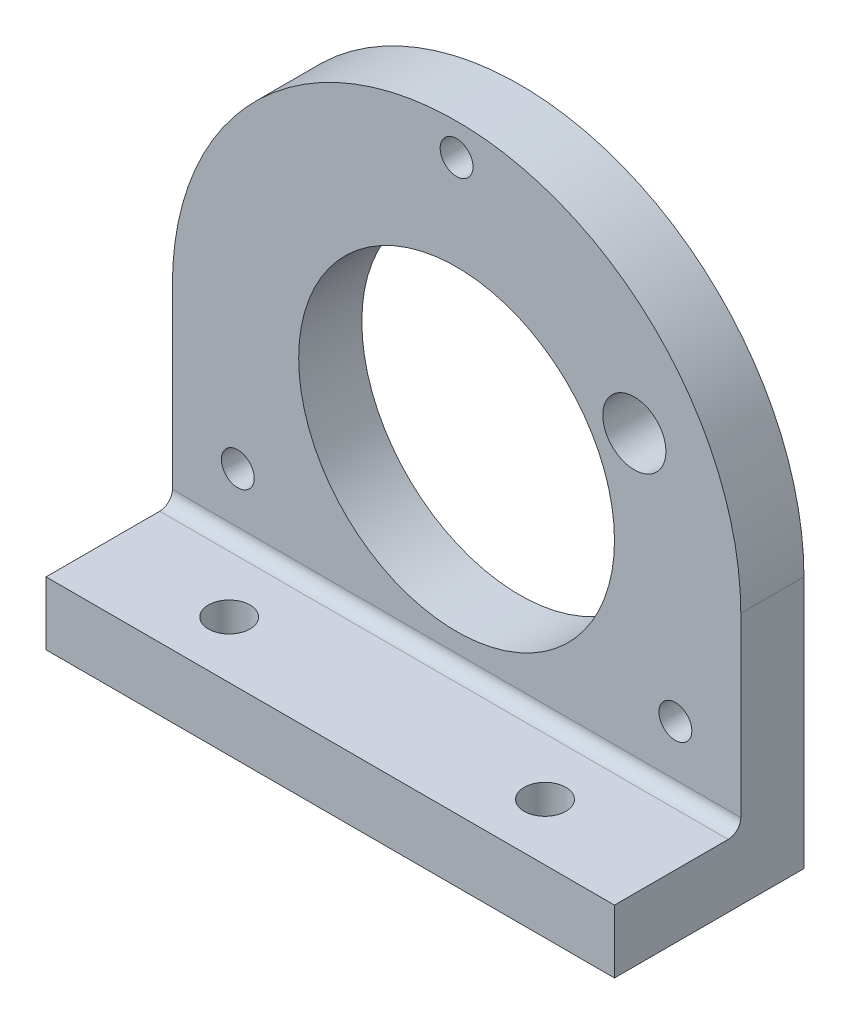
ISO-10303-21;
HEADER;
FILE_DESCRIPTION(('STEP AP214'),'2;1');
FILE_NAME('part.step','',(''),(''),'','','');
FILE_SCHEMA(('AUTOMOTIVE_DESIGN { 1 0 10303 214 1 1 1 1 }'));
ENDSEC;
DATA;
#1=APPLICATION_CONTEXT('core data for automotive mechanical design processes');
#2=APPLICATION_PROTOCOL_DEFINITION('international standard','automotive_design',2000,#1);
#3=PRODUCT_CONTEXT('',#1,'mechanical');
#4=PRODUCT('Part','Part','',(#3));
#5=PRODUCT_RELATED_PRODUCT_CATEGORY('part','',(#4));
#6=PRODUCT_DEFINITION_FORMATION('','',#4);
#7=PRODUCT_DEFINITION_CONTEXT('part definition',#1,'design');
#8=PRODUCT_DEFINITION('design','',#6,#7);
#9=PRODUCT_DEFINITION_SHAPE('','',#8);
#10=(LENGTH_UNIT() NAMED_UNIT(*) SI_UNIT(.MILLI.,.METRE.));
#11=(NAMED_UNIT(*) PLANE_ANGLE_UNIT() SI_UNIT($,.RADIAN.));
#12=(NAMED_UNIT(*) SI_UNIT($,.STERADIAN.) SOLID_ANGLE_UNIT());
#13=UNCERTAINTY_MEASURE_WITH_UNIT(LENGTH_MEASURE(1.E-05),#10,'distance_accuracy_value','');
#14=(GEOMETRIC_REPRESENTATION_CONTEXT(3) GLOBAL_UNCERTAINTY_ASSIGNED_CONTEXT((#13)) GLOBAL_UNIT_ASSIGNED_CONTEXT((#10,
#11,#12)) REPRESENTATION_CONTEXT('',''));
#15=CARTESIAN_POINT('',(0.,0.,0.));
#16=DIRECTION('',(0.,0.,1.));
#17=DIRECTION('',(1.,0.,0.));
#18=AXIS2_PLACEMENT_3D('',#15,#16,#17);
#19=CARTESIAN_POINT('',(0.,0.,4.));
#20=DIRECTION('',(0.,0.,-1.));
#21=DIRECTION('',(-1.,0.,0.));
#22=AXIS2_PLACEMENT_3D('',#19,#20,#21);
#23=CYLINDRICAL_SURFACE('',#22,22.5);
#24=CARTESIAN_POINT('',(0.,0.,7.));
#25=DIRECTION('',(0.,0.,-1.));
#26=DIRECTION('',(-1.,0.,0.));
#27=AXIS2_PLACEMENT_3D('',#24,#25,#26);
#28=CIRCLE('',#27,22.5);
#29=CARTESIAN_POINT('',(-22.5,0.,7.));
#30=VERTEX_POINT('',#29);
#31=CARTESIAN_POINT('',(22.5,0.,7.));
#32=VERTEX_POINT('',#31);
#33=EDGE_CURVE('E50',#30,#32,#28,.T.);
#34=ORIENTED_EDGE('',*,*,#33,.F.);
#35=DIRECTION('',(0.,0.,1.));
#36=VECTOR('',#35,1.);
#37=CARTESIAN_POINT('',(-22.5,0.,-23.4232921921325));
#38=LINE('',#37,#36);
#39=CARTESIAN_POINT('',(-22.5,0.,12.));
#40=VERTEX_POINT('',#39);
#41=EDGE_CURVE('E116',#30,#40,#38,.T.);
#42=ORIENTED_EDGE('',*,*,#41,.T.);
#43=CARTESIAN_POINT('',(0.,0.,12.));
#44=DIRECTION('',(0.,0.,-1.));
#45=DIRECTION('',(-1.,0.,0.));
#46=AXIS2_PLACEMENT_3D('',#43,#44,#45);
#47=CIRCLE('',#46,22.5);
#48=CARTESIAN_POINT('',(22.5,0.,12.));
#49=VERTEX_POINT('',#48);
#50=EDGE_CURVE('E159',#40,#49,#47,.T.);
#51=ORIENTED_EDGE('',*,*,#50,.T.);
#52=DIRECTION('',(0.,0.,1.));
#53=VECTOR('',#52,1.);
#54=CARTESIAN_POINT('',(22.5,0.,-23.4232921921325));
#55=LINE('',#54,#53);
#56=EDGE_CURVE('E113',#32,#49,#55,.T.);
#57=ORIENTED_EDGE('',*,*,#56,.F.);
#58=EDGE_LOOP('',(#34,#42,#51,#57));
#59=FACE_BOUND('',#58,.T.);
#60=ADVANCED_FACE('F34',(#59),#23,.T.);
#61=CARTESIAN_POINT('',(0.,0.,4.));
#62=DIRECTION('',(0.,0.,-1.));
#63=DIRECTION('',(-1.,0.,0.));
#64=AXIS2_PLACEMENT_3D('',#61,#62,#63);
#65=CYLINDRICAL_SURFACE('',#64,12.5);
#66=CARTESIAN_POINT('',(0.,0.,12.));
#67=DIRECTION('',(0.,0.,-1.));
#68=DIRECTION('',(-1.,0.,0.));
#69=AXIS2_PLACEMENT_3D('',#66,#67,#68);
#70=CIRCLE('',#69,12.5);
#71=CARTESIAN_POINT('',(-12.5,0.,12.));
#72=VERTEX_POINT('',#71);
#73=EDGE_CURVE('E161',#72,#72,#70,.T.);
#74=ORIENTED_EDGE('',*,*,#73,.F.);
#75=EDGE_LOOP('',(#74));
#76=FACE_BOUND('',#75,.T.);
#77=CARTESIAN_POINT('',(0.,0.,7.));
#78=DIRECTION('',(0.,0.,-1.));
#79=DIRECTION('',(-1.,0.,0.));
#80=AXIS2_PLACEMENT_3D('',#77,#78,#79);
#81=CIRCLE('',#80,12.5);
#82=CARTESIAN_POINT('',(-12.5,0.,7.));
#83=VERTEX_POINT('',#82);
#84=EDGE_CURVE('E184',#83,#83,#81,.T.);
#85=ORIENTED_EDGE('',*,*,#84,.T.);
#86=EDGE_LOOP('',(#85));
#87=FACE_BOUND('',#86,.T.);
#88=ADVANCED_FACE('F177',(#76,#87),#65,.F.);
#89=CARTESIAN_POINT('',(0.,20.,4.));
#90=DIRECTION('',(0.,0.,-1.));
#91=DIRECTION('',(-1.,0.,0.));
#92=AXIS2_PLACEMENT_3D('',#89,#90,#91);
#93=CYLINDRICAL_SURFACE('',#92,1.3);
#94=CARTESIAN_POINT('',(0.,20.,12.));
#95=DIRECTION('',(0.,0.,-1.));
#96=DIRECTION('',(-1.,0.,0.));
#97=AXIS2_PLACEMENT_3D('',#94,#95,#96);
#98=CIRCLE('',#97,1.3);
#99=CARTESIAN_POINT('',(-1.3,20.,12.));
#100=VERTEX_POINT('',#99);
#101=EDGE_CURVE('E168',#100,#100,#98,.T.);
#102=ORIENTED_EDGE('',*,*,#101,.F.);
#103=EDGE_LOOP('',(#102));
#104=FACE_BOUND('',#103,.T.);
#105=CARTESIAN_POINT('',(0.,20.,7.));
#106=DIRECTION('',(0.,0.,-1.));
#107=DIRECTION('',(-1.,0.,0.));
#108=AXIS2_PLACEMENT_3D('',#105,#106,#107);
#109=CIRCLE('',#108,1.3);
#110=CARTESIAN_POINT('',(-1.3,20.,7.));
#111=VERTEX_POINT('',#110);
#112=EDGE_CURVE('E186',#111,#111,#109,.T.);
#113=ORIENTED_EDGE('',*,*,#112,.T.);
#114=EDGE_LOOP('',(#113));
#115=FACE_BOUND('',#114,.T.);
#116=ADVANCED_FACE('F180',(#104,#115),#93,.F.);
#117=CARTESIAN_POINT('',(-17.3205080756888,-10.,4.));
#118=DIRECTION('',(0.,0.,-1.));
#119=DIRECTION('',(-1.,0.,0.));
#120=AXIS2_PLACEMENT_3D('',#117,#118,#119);
#121=CYLINDRICAL_SURFACE('',#120,1.3);
#122=CARTESIAN_POINT('',(-17.3205080756888,-10.,12.));
#123=DIRECTION('',(0.,0.,-1.));
#124=DIRECTION('',(-1.,0.,0.));
#125=AXIS2_PLACEMENT_3D('',#122,#123,#124);
#126=CIRCLE('',#125,1.3);
#127=CARTESIAN_POINT('',(-18.6205080756888,-10.,12.));
#128=VERTEX_POINT('',#127);
#129=EDGE_CURVE('E165',#128,#128,#126,.T.);
#130=ORIENTED_EDGE('',*,*,#129,.F.);
#131=EDGE_LOOP('',(#130));
#132=FACE_BOUND('',#131,.T.);
#133=CARTESIAN_POINT('',(-17.3205080756888,-10.,7.));
#134=DIRECTION('',(0.,0.,-1.));
#135=DIRECTION('',(-1.,0.,0.));
#136=AXIS2_PLACEMENT_3D('',#133,#134,#135);
#137=CIRCLE('',#136,1.3);
#138=CARTESIAN_POINT('',(-18.6205080756888,-10.,7.));
#139=VERTEX_POINT('',#138);
#140=EDGE_CURVE('E191',#139,#139,#137,.T.);
#141=ORIENTED_EDGE('',*,*,#140,.T.);
#142=EDGE_LOOP('',(#141));
#143=FACE_BOUND('',#142,.T.);
#144=ADVANCED_FACE('F213',(#132,#143),#121,.F.);
#145=CARTESIAN_POINT('',(17.3205080756888,-10.,4.));
#146=DIRECTION('',(0.,0.,-1.));
#147=DIRECTION('',(-1.,0.,0.));
#148=AXIS2_PLACEMENT_3D('',#145,#146,#147);
#149=CYLINDRICAL_SURFACE('',#148,1.3);
#150=CARTESIAN_POINT('',(17.3205080756888,-10.,12.));
#151=DIRECTION('',(0.,0.,-1.));
#152=DIRECTION('',(-1.,0.,0.));
#153=AXIS2_PLACEMENT_3D('',#150,#151,#152);
#154=CIRCLE('',#153,1.3);
#155=CARTESIAN_POINT('',(16.0205080756888,-10.,12.));
#156=VERTEX_POINT('',#155);
#157=EDGE_CURVE('E162',#156,#156,#154,.T.);
#158=ORIENTED_EDGE('',*,*,#157,.F.);
#159=EDGE_LOOP('',(#158));
#160=FACE_BOUND('',#159,.T.);
#161=CARTESIAN_POINT('',(17.3205080756888,-10.,7.));
#162=DIRECTION('',(0.,0.,-1.));
#163=DIRECTION('',(-1.,0.,0.));
#164=AXIS2_PLACEMENT_3D('',#161,#162,#163);
#165=CIRCLE('',#164,1.3);
#166=CARTESIAN_POINT('',(16.0205080756888,-10.,7.));
#167=VERTEX_POINT('',#166);
#168=EDGE_CURVE('E241',#167,#167,#165,.T.);
#169=ORIENTED_EDGE('',*,*,#168,.T.);
#170=EDGE_LOOP('',(#169));
#171=FACE_BOUND('',#170,.T.);
#172=ADVANCED_FACE('F217',(#160,#171),#149,.F.);
#173=CARTESIAN_POINT('',(-22.5,-20.,-23.4232921921325));
#174=DIRECTION('',(0.,-1.,0.));
#175=DIRECTION('',(1.,0.,0.));
#176=AXIS2_PLACEMENT_3D('',#173,#174,#175);
#177=PLANE('',#176);
#178=CARTESIAN_POINT('',(-12.5,-20.,17.5));
#179=DIRECTION('',(0.,-1.,0.));
#180=DIRECTION('',(1.,0.,0.));
#181=AXIS2_PLACEMENT_3D('',#178,#179,#180);
#182=CIRCLE('',#181,1.65);
#183=CARTESIAN_POINT('',(-10.85,-20.,17.5));
#184=VERTEX_POINT('',#183);
#185=EDGE_CURVE('E269',#184,#184,#182,.T.);
#186=ORIENTED_EDGE('',*,*,#185,.F.);
#187=EDGE_LOOP('',(#186));
#188=FACE_BOUND('',#187,.T.);
#189=CARTESIAN_POINT('',(12.5,-20.,17.5));
#190=DIRECTION('',(0.,-1.,0.));
#191=DIRECTION('',(1.,0.,0.));
#192=AXIS2_PLACEMENT_3D('',#189,#190,#191);
#193=CIRCLE('',#192,1.65);
#194=CARTESIAN_POINT('',(14.15,-20.,17.5));
#195=VERTEX_POINT('',#194);
#196=EDGE_CURVE('E273',#195,#195,#193,.T.);
#197=ORIENTED_EDGE('',*,*,#196,.F.);
#198=EDGE_LOOP('',(#197));
#199=FACE_BOUND('',#198,.T.);
#200=DIRECTION('',(0.,0.,1.));
#201=VECTOR('',#200,1.);
#202=CARTESIAN_POINT('',(-22.5,-20.,-23.4232921921325));
#203=LINE('',#202,#201);
#204=CARTESIAN_POINT('',(-22.5,-20.,7.));
#205=VERTEX_POINT('',#204);
#206=CARTESIAN_POINT('',(-22.5,-20.,22.));
#207=VERTEX_POINT('',#206);
#208=EDGE_CURVE('E106',#205,#207,#203,.T.);
#209=ORIENTED_EDGE('',*,*,#208,.F.);
#210=DIRECTION('',(-1.,0.,0.));
#211=VECTOR('',#210,1.);
#212=CARTESIAN_POINT('',(22.5,-20.,7.));
#213=LINE('',#212,#211);
#214=CARTESIAN_POINT('',(22.5,-20.,7.));
#215=VERTEX_POINT('',#214);
#216=EDGE_CURVE('E94',#215,#205,#213,.T.);
#217=ORIENTED_EDGE('',*,*,#216,.F.);
#218=DIRECTION('',(0.,0.,1.));
#219=VECTOR('',#218,1.);
#220=CARTESIAN_POINT('',(22.5,-20.,-23.4232921921325));
#221=LINE('',#220,#219);
#222=CARTESIAN_POINT('',(22.5,-20.,22.));
#223=VERTEX_POINT('',#222);
#224=EDGE_CURVE('E104',#215,#223,#221,.T.);
#225=ORIENTED_EDGE('',*,*,#224,.T.);
#226=DIRECTION('',(1.,0.,0.));
#227=VECTOR('',#226,1.);
#228=CARTESIAN_POINT('',(-22.5,-20.,22.));
#229=LINE('',#228,#227);
#230=EDGE_CURVE('E188',#207,#223,#229,.T.);
#231=ORIENTED_EDGE('',*,*,#230,.F.);
#232=EDGE_LOOP('',(#209,#217,#225,#231));
#233=FACE_BOUND('',#232,.T.);
#234=ADVANCED_FACE('F102',(#188,#199,#233),#177,.T.);
#235=CARTESIAN_POINT('',(-22.5,0.,-23.4232921921325));
#236=DIRECTION('',(-1.,0.,0.));
#237=DIRECTION('',(0.,0.,1.));
#238=AXIS2_PLACEMENT_3D('',#235,#236,#237);
#239=PLANE('',#238);
#240=ORIENTED_EDGE('',*,*,#41,.F.);
#241=DIRECTION('',(0.,1.,0.));
#242=VECTOR('',#241,1.);
#243=CARTESIAN_POINT('',(-22.5,-20.,7.));
#244=LINE('',#243,#242);
#245=EDGE_CURVE('E107',#205,#30,#244,.T.);
#246=ORIENTED_EDGE('',*,*,#245,.F.);
#247=ORIENTED_EDGE('',*,*,#208,.T.);
#248=DIRECTION('',(0.,-1.,0.));
#249=VECTOR('',#248,1.);
#250=CARTESIAN_POINT('',(-22.5,-20.,22.));
#251=LINE('',#250,#249);
#252=CARTESIAN_POINT('',(-22.5,-15.,22.));
#253=VERTEX_POINT('',#252);
#254=EDGE_CURVE('E149',#253,#207,#251,.T.);
#255=ORIENTED_EDGE('',*,*,#254,.F.);
#256=DIRECTION('',(0.,0.,-1.));
#257=VECTOR('',#256,1.);
#258=CARTESIAN_POINT('',(-22.5,-15.,22.));
#259=LINE('',#258,#257);
#260=CARTESIAN_POINT('',(-22.5,-15.,13.));
#261=VERTEX_POINT('',#260);
#262=EDGE_CURVE('E143',#253,#261,#259,.T.);
#263=ORIENTED_EDGE('',*,*,#262,.T.);
#264=CARTESIAN_POINT('',(-22.5,-14.,13.));
#265=DIRECTION('',(-1.,0.,0.));
#266=DIRECTION('',(0.,0.,1.));
#267=AXIS2_PLACEMENT_3D('',#264,#265,#266);
#268=CIRCLE('',#267,1.);
#269=CARTESIAN_POINT('',(-22.5,-14.,12.));
#270=VERTEX_POINT('',#269);
#271=EDGE_CURVE('E43',#261,#270,#268,.F.);
#272=ORIENTED_EDGE('',*,*,#271,.T.);
#273=DIRECTION('',(0.,-1.,0.));
#274=VECTOR('',#273,1.);
#275=CARTESIAN_POINT('',(-22.5,-20.,12.));
#276=LINE('',#275,#274);
#277=EDGE_CURVE('E119',#40,#270,#276,.T.);
#278=ORIENTED_EDGE('',*,*,#277,.F.);
#279=EDGE_LOOP('',(#240,#246,#247,#255,#263,#272,#278));
#280=FACE_BOUND('',#279,.T.);
#281=ADVANCED_FACE('F147',(#280),#239,.T.);
#282=CARTESIAN_POINT('',(22.5,-20.,-23.4232921921325));
#283=DIRECTION('',(1.,0.,0.));
#284=DIRECTION('',(0.,0.,-1.));
#285=AXIS2_PLACEMENT_3D('',#282,#283,#284);
#286=PLANE('',#285);
#287=ORIENTED_EDGE('',*,*,#224,.F.);
#288=DIRECTION('',(0.,-1.,0.));
#289=VECTOR('',#288,1.);
#290=CARTESIAN_POINT('',(22.5,0.,7.));
#291=LINE('',#290,#289);
#292=EDGE_CURVE('E90',#32,#215,#291,.T.);
#293=ORIENTED_EDGE('',*,*,#292,.F.);
#294=ORIENTED_EDGE('',*,*,#56,.T.);
#295=DIRECTION('',(0.,1.,0.));
#296=VECTOR('',#295,1.);
#297=CARTESIAN_POINT('',(22.5,-20.,12.));
#298=LINE('',#297,#296);
#299=CARTESIAN_POINT('',(22.5,-14.,12.));
#300=VERTEX_POINT('',#299);
#301=EDGE_CURVE('E114',#300,#49,#298,.T.);
#302=ORIENTED_EDGE('',*,*,#301,.F.);
#303=CARTESIAN_POINT('',(22.5,-14.,13.));
#304=DIRECTION('',(1.,0.,0.));
#305=DIRECTION('',(0.,0.,-1.));
#306=AXIS2_PLACEMENT_3D('',#303,#304,#305);
#307=CIRCLE('',#306,1.);
#308=CARTESIAN_POINT('',(22.5,-15.,13.));
#309=VERTEX_POINT('',#308);
#310=EDGE_CURVE('E11',#300,#309,#307,.F.);
#311=ORIENTED_EDGE('',*,*,#310,.T.);
#312=DIRECTION('',(0.,0.,-1.));
#313=VECTOR('',#312,1.);
#314=CARTESIAN_POINT('',(22.5,-15.,22.));
#315=LINE('',#314,#313);
#316=CARTESIAN_POINT('',(22.5,-15.,22.));
#317=VERTEX_POINT('',#316);
#318=EDGE_CURVE('E145',#317,#309,#315,.T.);
#319=ORIENTED_EDGE('',*,*,#318,.F.);
#320=DIRECTION('',(0.,1.,0.));
#321=VECTOR('',#320,1.);
#322=CARTESIAN_POINT('',(22.5,-20.,22.));
#323=LINE('',#322,#321);
#324=EDGE_CURVE('E112',#223,#317,#323,.T.);
#325=ORIENTED_EDGE('',*,*,#324,.F.);
#326=EDGE_LOOP('',(#287,#293,#294,#302,#311,#319,#325));
#327=FACE_BOUND('',#326,.T.);
#328=ADVANCED_FACE('F110',(#327),#286,.T.);
#329=CARTESIAN_POINT('',(14.0715154312395,8.12419322213215,2.));
#330=DIRECTION('',(0.,0.,1.));
#331=DIRECTION('',(1.,0.,0.));
#332=AXIS2_PLACEMENT_3D('',#329,#330,#331);
#333=CYLINDRICAL_SURFACE('',#332,2.5);
#334=CARTESIAN_POINT('',(14.0715154312395,8.12419322213215,12.));
#335=DIRECTION('',(0.,0.,1.));
#336=DIRECTION('',(1.,0.,0.));
#337=AXIS2_PLACEMENT_3D('',#334,#335,#336);
#338=CIRCLE('',#337,2.5);
#339=CARTESIAN_POINT('',(16.5715154312395,8.12419322213215,12.));
#340=VERTEX_POINT('',#339);
#341=EDGE_CURVE('E152',#340,#340,#338,.T.);
#342=ORIENTED_EDGE('',*,*,#341,.T.);
#343=EDGE_LOOP('',(#342));
#344=FACE_BOUND('',#343,.T.);
#345=CARTESIAN_POINT('',(14.0715154312395,8.12419322213215,7.));
#346=DIRECTION('',(0.,0.,-1.));
#347=DIRECTION('',(-1.,0.,0.));
#348=AXIS2_PLACEMENT_3D('',#345,#346,#347);
#349=CIRCLE('',#348,2.5);
#350=CARTESIAN_POINT('',(11.5715154312395,8.12419322213215,7.));
#351=VERTEX_POINT('',#350);
#352=EDGE_CURVE('E38',#351,#351,#349,.F.);
#353=ORIENTED_EDGE('',*,*,#352,.F.);
#354=EDGE_LOOP('',(#353));
#355=FACE_BOUND('',#354,.T.);
#356=ADVANCED_FACE('F229',(#344,#355),#333,.F.);
#357=CARTESIAN_POINT('',(0.,0.,12.));
#358=DIRECTION('',(0.,0.,-1.));
#359=DIRECTION('',(-1.,0.,0.));
#360=AXIS2_PLACEMENT_3D('',#357,#358,#359);
#361=PLANE('',#360);
#362=ORIENTED_EDGE('',*,*,#157,.T.);
#363=EDGE_LOOP('',(#362));
#364=FACE_BOUND('',#363,.T.);
#365=ORIENTED_EDGE('',*,*,#129,.T.);
#366=EDGE_LOOP('',(#365));
#367=FACE_BOUND('',#366,.T.);
#368=ORIENTED_EDGE('',*,*,#101,.T.);
#369=EDGE_LOOP('',(#368));
#370=FACE_BOUND('',#369,.T.);
#371=ORIENTED_EDGE('',*,*,#73,.T.);
#372=EDGE_LOOP('',(#371));
#373=FACE_BOUND('',#372,.T.);
#374=ORIENTED_EDGE('',*,*,#341,.F.);
#375=EDGE_LOOP('',(#374));
#376=FACE_BOUND('',#375,.T.);
#377=ORIENTED_EDGE('',*,*,#277,.T.);
#378=DIRECTION('',(-1.,0.,0.));
#379=VECTOR('',#378,1.);
#380=CARTESIAN_POINT('',(22.5,-14.,12.));
#381=LINE('',#380,#379);
#382=EDGE_CURVE('E127',#270,#300,#381,.F.);
#383=ORIENTED_EDGE('',*,*,#382,.T.);
#384=ORIENTED_EDGE('',*,*,#301,.T.);
#385=ORIENTED_EDGE('',*,*,#50,.F.);
#386=EDGE_LOOP('',(#377,#383,#384,#385));
#387=FACE_BOUND('',#386,.T.);
#388=ADVANCED_FACE('F132',(#364,#367,#370,#373,#376,#387),#361,.F.);
#389=CARTESIAN_POINT('',(-22.5,-15.,22.));
#390=DIRECTION('',(0.,-1.,0.));
#391=DIRECTION('',(0.,0.,-1.));
#392=AXIS2_PLACEMENT_3D('',#389,#390,#391);
#393=PLANE('',#392);
#394=CARTESIAN_POINT('',(-12.5,-15.,17.5));
#395=DIRECTION('',(0.,1.,0.));
#396=DIRECTION('',(0.,0.,1.));
#397=AXIS2_PLACEMENT_3D('',#394,#395,#396);
#398=CIRCLE('',#397,1.65);
#399=CARTESIAN_POINT('',(-12.5,-15.,19.15));
#400=VERTEX_POINT('',#399);
#401=EDGE_CURVE('E272',#400,#400,#398,.T.);
#402=ORIENTED_EDGE('',*,*,#401,.F.);
#403=EDGE_LOOP('',(#402));
#404=FACE_BOUND('',#403,.T.);
#405=CARTESIAN_POINT('',(12.5,-15.,17.5));
#406=DIRECTION('',(0.,1.,0.));
#407=DIRECTION('',(0.,0.,1.));
#408=AXIS2_PLACEMENT_3D('',#405,#406,#407);
#409=CIRCLE('',#408,1.65);
#410=CARTESIAN_POINT('',(12.5,-15.,19.15));
#411=VERTEX_POINT('',#410);
#412=EDGE_CURVE('E274',#411,#411,#409,.T.);
#413=ORIENTED_EDGE('',*,*,#412,.F.);
#414=EDGE_LOOP('',(#413));
#415=FACE_BOUND('',#414,.T.);
#416=ORIENTED_EDGE('',*,*,#318,.T.);
#417=DIRECTION('',(-1.,0.,0.));
#418=VECTOR('',#417,1.);
#419=CARTESIAN_POINT('',(-22.5,-15.,13.));
#420=LINE('',#419,#418);
#421=EDGE_CURVE('E123',#309,#261,#420,.T.);
#422=ORIENTED_EDGE('',*,*,#421,.T.);
#423=ORIENTED_EDGE('',*,*,#262,.F.);
#424=DIRECTION('',(-1.,0.,0.));
#425=VECTOR('',#424,1.);
#426=CARTESIAN_POINT('',(-22.5,-15.,22.));
#427=LINE('',#426,#425);
#428=EDGE_CURVE('E150',#317,#253,#427,.T.);
#429=ORIENTED_EDGE('',*,*,#428,.F.);
#430=EDGE_LOOP('',(#416,#422,#423,#429));
#431=FACE_BOUND('',#430,.T.);
#432=ADVANCED_FACE('F141',(#404,#415,#431),#393,.F.);
#433=CARTESIAN_POINT('',(0.,0.,22.));
#434=DIRECTION('',(0.,0.,-1.));
#435=DIRECTION('',(-1.,0.,0.));
#436=AXIS2_PLACEMENT_3D('',#433,#434,#435);
#437=PLANE('',#436);
#438=ORIENTED_EDGE('',*,*,#254,.T.);
#439=ORIENTED_EDGE('',*,*,#230,.T.);
#440=ORIENTED_EDGE('',*,*,#324,.T.);
#441=ORIENTED_EDGE('',*,*,#428,.T.);
#442=EDGE_LOOP('',(#438,#439,#440,#441));
#443=FACE_BOUND('',#442,.T.);
#444=ADVANCED_FACE('F196',(#443),#437,.F.);
#445=CARTESIAN_POINT('',(-22.5,-14.,13.));
#446=DIRECTION('',(1.,0.,0.));
#447=DIRECTION('',(0.,0.,-1.));
#448=AXIS2_PLACEMENT_3D('',#445,#446,#447);
#449=CYLINDRICAL_SURFACE('',#448,1.);
#450=ORIENTED_EDGE('',*,*,#310,.F.);
#451=ORIENTED_EDGE('',*,*,#382,.F.);
#452=ORIENTED_EDGE('',*,*,#271,.F.);
#453=ORIENTED_EDGE('',*,*,#421,.F.);
#454=EDGE_LOOP('',(#450,#451,#452,#453));
#455=FACE_BOUND('',#454,.T.);
#456=ADVANCED_FACE('F36',(#455),#449,.F.);
#457=CARTESIAN_POINT('',(0.,0.,7.));
#458=DIRECTION('',(0.,0.,-1.));
#459=DIRECTION('',(-1.,0.,0.));
#460=AXIS2_PLACEMENT_3D('',#457,#458,#459);
#461=PLANE('',#460);
#462=ORIENTED_EDGE('',*,*,#84,.F.);
#463=EDGE_LOOP('',(#462));
#464=FACE_BOUND('',#463,.T.);
#465=ORIENTED_EDGE('',*,*,#112,.F.);
#466=EDGE_LOOP('',(#465));
#467=FACE_BOUND('',#466,.T.);
#468=ORIENTED_EDGE('',*,*,#140,.F.);
#469=EDGE_LOOP('',(#468));
#470=FACE_BOUND('',#469,.T.);
#471=ORIENTED_EDGE('',*,*,#168,.F.);
#472=EDGE_LOOP('',(#471));
#473=FACE_BOUND('',#472,.T.);
#474=ORIENTED_EDGE('',*,*,#33,.T.);
#475=ORIENTED_EDGE('',*,*,#292,.T.);
#476=ORIENTED_EDGE('',*,*,#216,.T.);
#477=ORIENTED_EDGE('',*,*,#245,.T.);
#478=EDGE_LOOP('',(#474,#475,#476,#477));
#479=FACE_BOUND('',#478,.T.);
#480=ORIENTED_EDGE('',*,*,#352,.T.);
#481=EDGE_LOOP('',(#480));
#482=FACE_BOUND('',#481,.T.);
#483=ADVANCED_FACE('F92',(#464,#467,#470,#473,#479,#482),#461,.T.);
#484=CARTESIAN_POINT('',(12.5,-28.,17.5));
#485=DIRECTION('',(0.,1.,0.));
#486=DIRECTION('',(0.,0.,1.));
#487=AXIS2_PLACEMENT_3D('',#484,#485,#486);
#488=CYLINDRICAL_SURFACE('',#487,1.65);
#489=ORIENTED_EDGE('',*,*,#196,.T.);
#490=EDGE_LOOP('',(#489));
#491=FACE_BOUND('',#490,.T.);
#492=ORIENTED_EDGE('',*,*,#412,.T.);
#493=EDGE_LOOP('',(#492));
#494=FACE_BOUND('',#493,.T.);
#495=ADVANCED_FACE('F251',(#491,#494),#488,.F.);
#496=CARTESIAN_POINT('',(-12.5,-28.,17.5));
#497=DIRECTION('',(0.,1.,0.));
#498=DIRECTION('',(0.,0.,1.));
#499=AXIS2_PLACEMENT_3D('',#496,#497,#498);
#500=CYLINDRICAL_SURFACE('',#499,1.65);
#501=ORIENTED_EDGE('',*,*,#185,.T.);
#502=EDGE_LOOP('',(#501));
#503=FACE_BOUND('',#502,.T.);
#504=ORIENTED_EDGE('',*,*,#401,.T.);
#505=EDGE_LOOP('',(#504));
#506=FACE_BOUND('',#505,.T.);
#507=ADVANCED_FACE('F257',(#503,#506),#500,.F.);
#508=CLOSED_SHELL('',(#60,#88,#116,#144,#172,#234,#281,#328,#356,#388,#432,#444,#456,#483,#495,#507));
#509=MANIFOLD_SOLID_BREP('B2',#508);
#510=ADVANCED_BREP_SHAPE_REPRESENTATION('',(#18,#509),#14);
#511=SHAPE_DEFINITION_REPRESENTATION(#9,#510);
ENDSEC;
END-ISO-10303-21;
